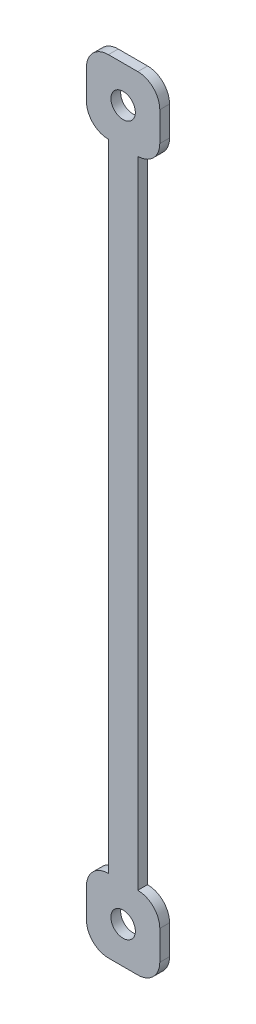
ISO-10303-21;
HEADER;
FILE_DESCRIPTION(('STEP AP214'),'2;1');
FILE_NAME('part.step','',(''),(''),'','','');
FILE_SCHEMA(('AUTOMOTIVE_DESIGN { 1 0 10303 214 1 1 1 1 }'));
ENDSEC;
DATA;
#1=APPLICATION_CONTEXT('core data for automotive mechanical design processes');
#2=APPLICATION_PROTOCOL_DEFINITION('international standard','automotive_design',2000,#1);
#3=PRODUCT_CONTEXT('',#1,'mechanical');
#4=PRODUCT('Part','Part','',(#3));
#5=PRODUCT_RELATED_PRODUCT_CATEGORY('part','',(#4));
#6=PRODUCT_DEFINITION_FORMATION('','',#4);
#7=PRODUCT_DEFINITION_CONTEXT('part definition',#1,'design');
#8=PRODUCT_DEFINITION('design','',#6,#7);
#9=PRODUCT_DEFINITION_SHAPE('','',#8);
#10=(LENGTH_UNIT() NAMED_UNIT(*) SI_UNIT(.MILLI.,.METRE.));
#11=(NAMED_UNIT(*) PLANE_ANGLE_UNIT() SI_UNIT($,.RADIAN.));
#12=(NAMED_UNIT(*) SI_UNIT($,.STERADIAN.) SOLID_ANGLE_UNIT());
#13=UNCERTAINTY_MEASURE_WITH_UNIT(LENGTH_MEASURE(1.E-05),#10,'distance_accuracy_value','');
#14=(GEOMETRIC_REPRESENTATION_CONTEXT(3) GLOBAL_UNCERTAINTY_ASSIGNED_CONTEXT((#13)) GLOBAL_UNIT_ASSIGNED_CONTEXT((#10,
#11,#12)) REPRESENTATION_CONTEXT('',''));
#15=CARTESIAN_POINT('',(0.,0.,0.));
#16=DIRECTION('',(0.,0.,1.));
#17=DIRECTION('',(1.,0.,0.));
#18=AXIS2_PLACEMENT_3D('',#15,#16,#17);
#19=CARTESIAN_POINT('',(0.,0.,2.));
#20=DIRECTION('',(0.,0.,-1.));
#21=DIRECTION('',(-1.,0.,0.));
#22=AXIS2_PLACEMENT_3D('',#19,#20,#21);
#23=PLANE('',#22);
#24=DIRECTION('',(-1.,0.,0.));
#25=VECTOR('',#24,1.);
#26=CARTESIAN_POINT('',(-7.5,7.5,2.));
#27=LINE('',#26,#25);
#28=CARTESIAN_POINT('',(3.,7.5,2.));
#29=VERTEX_POINT('',#28);
#30=CARTESIAN_POINT('',(-3.,7.5,2.));
#31=VERTEX_POINT('',#30);
#32=EDGE_CURVE('E308',#29,#31,#27,.T.);
#33=ORIENTED_EDGE('',*,*,#32,.T.);
#34=CARTESIAN_POINT('',(-3.,3.,2.));
#35=DIRECTION('',(0.,0.,-1.));
#36=DIRECTION('',(-1.,0.,0.));
#37=AXIS2_PLACEMENT_3D('',#34,#35,#36);
#38=CIRCLE('',#37,4.5);
#39=CARTESIAN_POINT('',(-7.5,3.,2.));
#40=VERTEX_POINT('',#39);
#41=EDGE_CURVE('E170',#31,#40,#38,.F.);
#42=ORIENTED_EDGE('',*,*,#41,.T.);
#43=DIRECTION('',(0.,-1.,0.));
#44=VECTOR('',#43,1.);
#45=CARTESIAN_POINT('',(-7.5,7.5,2.));
#46=LINE('',#45,#44);
#47=CARTESIAN_POINT('',(-7.5,-3.,2.));
#48=VERTEX_POINT('',#47);
#49=EDGE_CURVE('E165',#40,#48,#46,.T.);
#50=ORIENTED_EDGE('',*,*,#49,.T.);
#51=CARTESIAN_POINT('',(-3.,-3.,2.));
#52=DIRECTION('',(0.,0.,-1.));
#53=DIRECTION('',(-1.,0.,0.));
#54=AXIS2_PLACEMENT_3D('',#51,#52,#53);
#55=CIRCLE('',#54,4.5);
#56=CARTESIAN_POINT('',(-3.00000000000002,-7.5,2.));
#57=VERTEX_POINT('',#56);
#58=EDGE_CURVE('E158',#48,#57,#55,.F.);
#59=ORIENTED_EDGE('',*,*,#58,.T.);
#60=DIRECTION('',(0.,-1.,0.));
#61=VECTOR('',#60,1.);
#62=CARTESIAN_POINT('',(-3.00000000000002,-7.5,2.));
#63=LINE('',#62,#61);
#64=CARTESIAN_POINT('',(-3.,-137.5,2.));
#65=VERTEX_POINT('',#64);
#66=EDGE_CURVE('E162',#57,#65,#63,.T.);
#67=ORIENTED_EDGE('',*,*,#66,.T.);
#68=CARTESIAN_POINT('',(-3.,-142.,2.));
#69=DIRECTION('',(0.,0.,-1.));
#70=DIRECTION('',(-1.,0.,0.));
#71=AXIS2_PLACEMENT_3D('',#68,#69,#70);
#72=CIRCLE('',#71,4.5);
#73=CARTESIAN_POINT('',(-7.5,-142.,2.));
#74=VERTEX_POINT('',#73);
#75=EDGE_CURVE('E230',#65,#74,#72,.F.);
#76=ORIENTED_EDGE('',*,*,#75,.T.);
#77=DIRECTION('',(0.,-1.,0.));
#78=VECTOR('',#77,1.);
#79=CARTESIAN_POINT('',(-7.5,-137.5,2.));
#80=LINE('',#79,#78);
#81=CARTESIAN_POINT('',(-7.5,-148.,2.));
#82=VERTEX_POINT('',#81);
#83=EDGE_CURVE('E182',#74,#82,#80,.T.);
#84=ORIENTED_EDGE('',*,*,#83,.T.);
#85=CARTESIAN_POINT('',(-3.,-148.,2.));
#86=DIRECTION('',(0.,0.,-1.));
#87=DIRECTION('',(-1.,0.,0.));
#88=AXIS2_PLACEMENT_3D('',#85,#86,#87);
#89=CIRCLE('',#88,4.5);
#90=CARTESIAN_POINT('',(-3.,-152.5,2.));
#91=VERTEX_POINT('',#90);
#92=EDGE_CURVE('E233',#82,#91,#89,.F.);
#93=ORIENTED_EDGE('',*,*,#92,.T.);
#94=DIRECTION('',(1.,0.,0.));
#95=VECTOR('',#94,1.);
#96=CARTESIAN_POINT('',(-7.5,-152.5,2.));
#97=LINE('',#96,#95);
#98=CARTESIAN_POINT('',(3.,-152.5,2.));
#99=VERTEX_POINT('',#98);
#100=EDGE_CURVE('E352',#91,#99,#97,.T.);
#101=ORIENTED_EDGE('',*,*,#100,.T.);
#102=CARTESIAN_POINT('',(3.,-148.,2.));
#103=DIRECTION('',(0.,0.,-1.));
#104=DIRECTION('',(-1.,0.,0.));
#105=AXIS2_PLACEMENT_3D('',#102,#103,#104);
#106=CIRCLE('',#105,4.5);
#107=CARTESIAN_POINT('',(7.5,-148.,2.));
#108=VERTEX_POINT('',#107);
#109=EDGE_CURVE('E239',#99,#108,#106,.F.);
#110=ORIENTED_EDGE('',*,*,#109,.T.);
#111=DIRECTION('',(0.,1.,0.));
#112=VECTOR('',#111,1.);
#113=CARTESIAN_POINT('',(7.5,-152.5,2.));
#114=LINE('',#113,#112);
#115=CARTESIAN_POINT('',(7.5,-142.,2.));
#116=VERTEX_POINT('',#115);
#117=EDGE_CURVE('E334',#108,#116,#114,.T.);
#118=ORIENTED_EDGE('',*,*,#117,.T.);
#119=CARTESIAN_POINT('',(3.,-142.,2.));
#120=DIRECTION('',(0.,0.,-1.));
#121=DIRECTION('',(-1.,0.,0.));
#122=AXIS2_PLACEMENT_3D('',#119,#120,#121);
#123=CIRCLE('',#122,4.5);
#124=CARTESIAN_POINT('',(3.,-137.5,2.));
#125=VERTEX_POINT('',#124);
#126=EDGE_CURVE('E236',#116,#125,#123,.F.);
#127=ORIENTED_EDGE('',*,*,#126,.T.);
#128=DIRECTION('',(0.,1.,0.));
#129=VECTOR('',#128,1.);
#130=CARTESIAN_POINT('',(3.,-137.5,2.));
#131=LINE('',#130,#129);
#132=CARTESIAN_POINT('',(3.,-7.50000000000001,2.));
#133=VERTEX_POINT('',#132);
#134=EDGE_CURVE('E321',#125,#133,#131,.T.);
#135=ORIENTED_EDGE('',*,*,#134,.T.);
#136=CARTESIAN_POINT('',(3.,-3.00000000000001,2.));
#137=DIRECTION('',(0.,0.,-1.));
#138=DIRECTION('',(-1.,0.,0.));
#139=AXIS2_PLACEMENT_3D('',#136,#137,#138);
#140=CIRCLE('',#139,4.5);
#141=CARTESIAN_POINT('',(7.5,-3.00000000000001,2.));
#142=VERTEX_POINT('',#141);
#143=EDGE_CURVE('E68',#133,#142,#140,.F.);
#144=ORIENTED_EDGE('',*,*,#143,.T.);
#145=DIRECTION('',(0.,1.,0.));
#146=VECTOR('',#145,1.);
#147=CARTESIAN_POINT('',(7.5,7.5,2.));
#148=LINE('',#147,#146);
#149=CARTESIAN_POINT('',(7.5,3.,2.));
#150=VERTEX_POINT('',#149);
#151=EDGE_CURVE('E312',#142,#150,#148,.T.);
#152=ORIENTED_EDGE('',*,*,#151,.T.);
#153=CARTESIAN_POINT('',(3.,3.,2.));
#154=DIRECTION('',(0.,0.,-1.));
#155=DIRECTION('',(-1.,0.,0.));
#156=AXIS2_PLACEMENT_3D('',#153,#154,#155);
#157=CIRCLE('',#156,4.5);
#158=EDGE_CURVE('E242',#150,#29,#157,.F.);
#159=ORIENTED_EDGE('',*,*,#158,.T.);
#160=EDGE_LOOP('',(#33,#42,#50,#59,#67,#76,#84,#93,#101,#110,#118,#127,#135,#144,#152,#159));
#161=FACE_BOUND('',#160,.T.);
#162=CARTESIAN_POINT('',(0.,0.,2.));
#163=DIRECTION('',(0.,0.,1.));
#164=DIRECTION('',(1.,0.,0.));
#165=AXIS2_PLACEMENT_3D('',#162,#163,#164);
#166=CIRCLE('',#165,2.5);
#167=CARTESIAN_POINT('',(2.5,0.,2.));
#168=VERTEX_POINT('',#167);
#169=EDGE_CURVE('E341',#168,#168,#166,.T.);
#170=ORIENTED_EDGE('',*,*,#169,.F.);
#171=EDGE_LOOP('',(#170));
#172=FACE_BOUND('',#171,.T.);
#173=CARTESIAN_POINT('',(0.,-145.,2.));
#174=DIRECTION('',(0.,0.,1.));
#175=DIRECTION('',(1.,0.,0.));
#176=AXIS2_PLACEMENT_3D('',#173,#174,#175);
#177=CIRCLE('',#176,2.5);
#178=CARTESIAN_POINT('',(2.5,-145.,2.));
#179=VERTEX_POINT('',#178);
#180=EDGE_CURVE('E381',#179,#179,#177,.T.);
#181=ORIENTED_EDGE('',*,*,#180,.F.);
#182=EDGE_LOOP('',(#181));
#183=FACE_BOUND('',#182,.T.);
#184=ADVANCED_FACE('F45',(#161,#172,#183),#23,.F.);
#185=CARTESIAN_POINT('',(0.,0.,0.));
#186=DIRECTION('',(0.,0.,-1.));
#187=DIRECTION('',(-1.,0.,0.));
#188=AXIS2_PLACEMENT_3D('',#185,#186,#187);
#189=PLANE('',#188);
#190=CARTESIAN_POINT('',(0.,0.,0.));
#191=DIRECTION('',(0.,0.,1.));
#192=DIRECTION('',(1.,0.,0.));
#193=AXIS2_PLACEMENT_3D('',#190,#191,#192);
#194=CIRCLE('',#193,2.5);
#195=CARTESIAN_POINT('',(2.5,0.,0.));
#196=VERTEX_POINT('',#195);
#197=EDGE_CURVE('E377',#196,#196,#194,.T.);
#198=ORIENTED_EDGE('',*,*,#197,.T.);
#199=EDGE_LOOP('',(#198));
#200=FACE_BOUND('',#199,.T.);
#201=DIRECTION('',(0.,-1.,0.));
#202=VECTOR('',#201,1.);
#203=CARTESIAN_POINT('',(-7.5,7.5,0.));
#204=LINE('',#203,#202);
#205=CARTESIAN_POINT('',(-7.5,3.,0.));
#206=VERTEX_POINT('',#205);
#207=CARTESIAN_POINT('',(-7.5,-3.,0.));
#208=VERTEX_POINT('',#207);
#209=EDGE_CURVE('E294',#206,#208,#204,.T.);
#210=ORIENTED_EDGE('',*,*,#209,.F.);
#211=CARTESIAN_POINT('',(-3.,3.,0.));
#212=DIRECTION('',(0.,0.,-1.));
#213=DIRECTION('',(-1.,0.,0.));
#214=AXIS2_PLACEMENT_3D('',#211,#212,#213);
#215=CIRCLE('',#214,4.5);
#216=CARTESIAN_POINT('',(-3.,7.5,0.));
#217=VERTEX_POINT('',#216);
#218=EDGE_CURVE('E220',#206,#217,#215,.T.);
#219=ORIENTED_EDGE('',*,*,#218,.T.);
#220=DIRECTION('',(-1.,0.,0.));
#221=VECTOR('',#220,1.);
#222=CARTESIAN_POINT('',(-7.5,7.5,0.));
#223=LINE('',#222,#221);
#224=CARTESIAN_POINT('',(3.,7.5,0.));
#225=VERTEX_POINT('',#224);
#226=EDGE_CURVE('E338',#225,#217,#223,.T.);
#227=ORIENTED_EDGE('',*,*,#226,.F.);
#228=CARTESIAN_POINT('',(3.,3.,0.));
#229=DIRECTION('',(0.,0.,-1.));
#230=DIRECTION('',(-1.,0.,0.));
#231=AXIS2_PLACEMENT_3D('',#228,#229,#230);
#232=CIRCLE('',#231,4.5);
#233=CARTESIAN_POINT('',(7.5,3.,0.));
#234=VERTEX_POINT('',#233);
#235=EDGE_CURVE('E212',#225,#234,#232,.T.);
#236=ORIENTED_EDGE('',*,*,#235,.T.);
#237=DIRECTION('',(0.,1.,0.));
#238=VECTOR('',#237,1.);
#239=CARTESIAN_POINT('',(7.5,7.5,0.));
#240=LINE('',#239,#238);
#241=CARTESIAN_POINT('',(7.5,-3.00000000000001,0.));
#242=VERTEX_POINT('',#241);
#243=EDGE_CURVE('E305',#242,#234,#240,.T.);
#244=ORIENTED_EDGE('',*,*,#243,.F.);
#245=CARTESIAN_POINT('',(3.,-3.00000000000001,0.));
#246=DIRECTION('',(0.,0.,-1.));
#247=DIRECTION('',(-1.,0.,0.));
#248=AXIS2_PLACEMENT_3D('',#245,#246,#247);
#249=CIRCLE('',#248,4.5);
#250=CARTESIAN_POINT('',(3.,-7.50000000000001,0.));
#251=VERTEX_POINT('',#250);
#252=EDGE_CURVE('E215',#242,#251,#249,.T.);
#253=ORIENTED_EDGE('',*,*,#252,.T.);
#254=DIRECTION('',(0.,1.,0.));
#255=VECTOR('',#254,1.);
#256=CARTESIAN_POINT('',(3.,-137.5,0.));
#257=LINE('',#256,#255);
#258=CARTESIAN_POINT('',(3.,-137.5,0.));
#259=VERTEX_POINT('',#258);
#260=EDGE_CURVE('E301',#259,#251,#257,.T.);
#261=ORIENTED_EDGE('',*,*,#260,.F.);
#262=CARTESIAN_POINT('',(3.,-142.,0.));
#263=DIRECTION('',(0.,0.,-1.));
#264=DIRECTION('',(-1.,0.,0.));
#265=AXIS2_PLACEMENT_3D('',#262,#263,#264);
#266=CIRCLE('',#265,4.5);
#267=CARTESIAN_POINT('',(7.5,-142.,0.));
#268=VERTEX_POINT('',#267);
#269=EDGE_CURVE('E206',#259,#268,#266,.T.);
#270=ORIENTED_EDGE('',*,*,#269,.T.);
#271=DIRECTION('',(0.,1.,0.));
#272=VECTOR('',#271,1.);
#273=CARTESIAN_POINT('',(7.5,-152.5,0.));
#274=LINE('',#273,#272);
#275=CARTESIAN_POINT('',(7.5,-148.,0.));
#276=VERTEX_POINT('',#275);
#277=EDGE_CURVE('E292',#276,#268,#274,.T.);
#278=ORIENTED_EDGE('',*,*,#277,.F.);
#279=CARTESIAN_POINT('',(3.,-148.,0.));
#280=DIRECTION('',(0.,0.,-1.));
#281=DIRECTION('',(-1.,0.,0.));
#282=AXIS2_PLACEMENT_3D('',#279,#280,#281);
#283=CIRCLE('',#282,4.5);
#284=CARTESIAN_POINT('',(3.,-152.5,0.));
#285=VERTEX_POINT('',#284);
#286=EDGE_CURVE('E209',#276,#285,#283,.T.);
#287=ORIENTED_EDGE('',*,*,#286,.T.);
#288=DIRECTION('',(1.,0.,0.));
#289=VECTOR('',#288,1.);
#290=CARTESIAN_POINT('',(-7.5,-152.5,0.));
#291=LINE('',#290,#289);
#292=CARTESIAN_POINT('',(-3.,-152.5,0.));
#293=VERTEX_POINT('',#292);
#294=EDGE_CURVE('E286',#293,#285,#291,.T.);
#295=ORIENTED_EDGE('',*,*,#294,.F.);
#296=CARTESIAN_POINT('',(-3.,-148.,0.));
#297=DIRECTION('',(0.,0.,-1.));
#298=DIRECTION('',(-1.,0.,0.));
#299=AXIS2_PLACEMENT_3D('',#296,#297,#298);
#300=CIRCLE('',#299,4.5);
#301=CARTESIAN_POINT('',(-7.5,-148.,0.));
#302=VERTEX_POINT('',#301);
#303=EDGE_CURVE('E203',#293,#302,#300,.T.);
#304=ORIENTED_EDGE('',*,*,#303,.T.);
#305=DIRECTION('',(0.,-1.,0.));
#306=VECTOR('',#305,1.);
#307=CARTESIAN_POINT('',(-7.5,-137.5,0.));
#308=LINE('',#307,#306);
#309=CARTESIAN_POINT('',(-7.5,-142.,0.));
#310=VERTEX_POINT('',#309);
#311=EDGE_CURVE('E276',#310,#302,#308,.T.);
#312=ORIENTED_EDGE('',*,*,#311,.F.);
#313=CARTESIAN_POINT('',(-3.,-142.,0.));
#314=DIRECTION('',(0.,0.,-1.));
#315=DIRECTION('',(-1.,0.,0.));
#316=AXIS2_PLACEMENT_3D('',#313,#314,#315);
#317=CIRCLE('',#316,4.5);
#318=CARTESIAN_POINT('',(-3.,-137.5,0.));
#319=VERTEX_POINT('',#318);
#320=EDGE_CURVE('E200',#310,#319,#317,.T.);
#321=ORIENTED_EDGE('',*,*,#320,.T.);
#322=DIRECTION('',(0.,-1.,0.));
#323=VECTOR('',#322,1.);
#324=CARTESIAN_POINT('',(-3.00000000000002,-7.5,0.));
#325=LINE('',#324,#323);
#326=CARTESIAN_POINT('',(-3.00000000000002,-7.5,0.));
#327=VERTEX_POINT('',#326);
#328=EDGE_CURVE('E287',#327,#319,#325,.T.);
#329=ORIENTED_EDGE('',*,*,#328,.F.);
#330=CARTESIAN_POINT('',(-3.,-3.,0.));
#331=DIRECTION('',(0.,0.,-1.));
#332=DIRECTION('',(-1.,0.,0.));
#333=AXIS2_PLACEMENT_3D('',#330,#331,#332);
#334=CIRCLE('',#333,4.5);
#335=EDGE_CURVE('E185',#327,#208,#334,.T.);
#336=ORIENTED_EDGE('',*,*,#335,.T.);
#337=EDGE_LOOP('',(#210,#219,#227,#236,#244,#253,#261,#270,#278,#287,#295,#304,#312,#321,#329,#336));
#338=FACE_BOUND('',#337,.T.);
#339=CARTESIAN_POINT('',(0.,-145.,0.));
#340=DIRECTION('',(0.,0.,1.));
#341=DIRECTION('',(1.,0.,0.));
#342=AXIS2_PLACEMENT_3D('',#339,#340,#341);
#343=CIRCLE('',#342,2.5);
#344=CARTESIAN_POINT('',(2.5,-145.,0.));
#345=VERTEX_POINT('',#344);
#346=EDGE_CURVE('E385',#345,#345,#343,.T.);
#347=ORIENTED_EDGE('',*,*,#346,.T.);
#348=EDGE_LOOP('',(#347));
#349=FACE_BOUND('',#348,.T.);
#350=ADVANCED_FACE('F282',(#200,#338,#349),#189,.T.);
#351=CARTESIAN_POINT('',(-7.5,7.5,2.));
#352=DIRECTION('',(0.,-1.,0.));
#353=DIRECTION('',(0.,0.,-1.));
#354=AXIS2_PLACEMENT_3D('',#351,#352,#353);
#355=PLANE('',#354);
#356=ORIENTED_EDGE('',*,*,#226,.T.);
#357=DIRECTION('',(0.,0.,-1.));
#358=VECTOR('',#357,1.);
#359=CARTESIAN_POINT('',(-3.,7.5,2.));
#360=LINE('',#359,#358);
#361=EDGE_CURVE('E227',#217,#31,#360,.F.);
#362=ORIENTED_EDGE('',*,*,#361,.T.);
#363=ORIENTED_EDGE('',*,*,#32,.F.);
#364=DIRECTION('',(0.,0.,-1.));
#365=VECTOR('',#364,1.);
#366=CARTESIAN_POINT('',(3.,7.5,2.));
#367=LINE('',#366,#365);
#368=EDGE_CURVE('E223',#29,#225,#367,.T.);
#369=ORIENTED_EDGE('',*,*,#368,.T.);
#370=EDGE_LOOP('',(#356,#362,#363,#369));
#371=FACE_BOUND('',#370,.T.);
#372=ADVANCED_FACE('F402',(#371),#355,.F.);
#373=CARTESIAN_POINT('',(-7.5,7.5,2.));
#374=DIRECTION('',(1.,0.,0.));
#375=DIRECTION('',(0.,1.,0.));
#376=AXIS2_PLACEMENT_3D('',#373,#374,#375);
#377=PLANE('',#376);
#378=ORIENTED_EDGE('',*,*,#49,.F.);
#379=DIRECTION('',(0.,0.,-1.));
#380=VECTOR('',#379,1.);
#381=CARTESIAN_POINT('',(-7.5,3.,2.));
#382=LINE('',#381,#380);
#383=EDGE_CURVE('E191',#40,#206,#382,.T.);
#384=ORIENTED_EDGE('',*,*,#383,.T.);
#385=ORIENTED_EDGE('',*,*,#209,.T.);
#386=DIRECTION('',(0.,0.,-1.));
#387=VECTOR('',#386,1.);
#388=CARTESIAN_POINT('',(-7.5,-3.,2.));
#389=LINE('',#388,#387);
#390=EDGE_CURVE('E187',#208,#48,#389,.F.);
#391=ORIENTED_EDGE('',*,*,#390,.T.);
#392=EDGE_LOOP('',(#378,#384,#385,#391));
#393=FACE_BOUND('',#392,.T.);
#394=ADVANCED_FACE('F345',(#393),#377,.F.);
#395=CARTESIAN_POINT('',(-3.00000000000002,-7.5,2.));
#396=DIRECTION('',(1.,0.,0.));
#397=DIRECTION('',(0.,1.,0.));
#398=AXIS2_PLACEMENT_3D('',#395,#396,#397);
#399=PLANE('',#398);
#400=ORIENTED_EDGE('',*,*,#328,.T.);
#401=DIRECTION('',(0.,0.,-1.));
#402=VECTOR('',#401,1.);
#403=CARTESIAN_POINT('',(-3.,-137.5,2.));
#404=LINE('',#403,#402);
#405=EDGE_CURVE('E179',#65,#319,#404,.T.);
#406=ORIENTED_EDGE('',*,*,#405,.F.);
#407=ORIENTED_EDGE('',*,*,#66,.F.);
#408=DIRECTION('',(0.,0.,-1.));
#409=VECTOR('',#408,1.);
#410=CARTESIAN_POINT('',(-3.00000000000002,-7.5,2.));
#411=LINE('',#410,#409);
#412=EDGE_CURVE('E176',#57,#327,#411,.T.);
#413=ORIENTED_EDGE('',*,*,#412,.T.);
#414=EDGE_LOOP('',(#400,#406,#407,#413));
#415=FACE_BOUND('',#414,.T.);
#416=ADVANCED_FACE('F175',(#415),#399,.F.);
#417=CARTESIAN_POINT('',(-7.5,-137.5,2.));
#418=DIRECTION('',(1.,0.,0.));
#419=DIRECTION('',(0.,0.,-1.));
#420=AXIS2_PLACEMENT_3D('',#417,#418,#419);
#421=PLANE('',#420);
#422=ORIENTED_EDGE('',*,*,#311,.T.);
#423=DIRECTION('',(0.,0.,-1.));
#424=VECTOR('',#423,1.);
#425=CARTESIAN_POINT('',(-7.5,-148.,2.));
#426=LINE('',#425,#424);
#427=EDGE_CURVE('E11',#302,#82,#426,.F.);
#428=ORIENTED_EDGE('',*,*,#427,.T.);
#429=ORIENTED_EDGE('',*,*,#83,.F.);
#430=DIRECTION('',(0.,0.,-1.));
#431=VECTOR('',#430,1.);
#432=CARTESIAN_POINT('',(-7.5,-142.,2.));
#433=LINE('',#432,#431);
#434=EDGE_CURVE('E54',#74,#310,#433,.T.);
#435=ORIENTED_EDGE('',*,*,#434,.T.);
#436=EDGE_LOOP('',(#422,#428,#429,#435));
#437=FACE_BOUND('',#436,.T.);
#438=ADVANCED_FACE('F275',(#437),#421,.F.);
#439=CARTESIAN_POINT('',(-7.5,-152.5,2.));
#440=DIRECTION('',(0.,1.,0.));
#441=DIRECTION('',(0.,0.,1.));
#442=AXIS2_PLACEMENT_3D('',#439,#440,#441);
#443=PLANE('',#442);
#444=ORIENTED_EDGE('',*,*,#294,.T.);
#445=DIRECTION('',(0.,0.,-1.));
#446=VECTOR('',#445,1.);
#447=CARTESIAN_POINT('',(3.,-152.5,2.));
#448=LINE('',#447,#446);
#449=EDGE_CURVE('E266',#285,#99,#448,.F.);
#450=ORIENTED_EDGE('',*,*,#449,.T.);
#451=ORIENTED_EDGE('',*,*,#100,.F.);
#452=DIRECTION('',(0.,0.,-1.));
#453=VECTOR('',#452,1.);
#454=CARTESIAN_POINT('',(-3.,-152.5,2.));
#455=LINE('',#454,#453);
#456=EDGE_CURVE('E262',#91,#293,#455,.T.);
#457=ORIENTED_EDGE('',*,*,#456,.T.);
#458=EDGE_LOOP('',(#444,#450,#451,#457));
#459=FACE_BOUND('',#458,.T.);
#460=ADVANCED_FACE('F358',(#459),#443,.F.);
#461=CARTESIAN_POINT('',(7.5,-152.5,2.));
#462=DIRECTION('',(-1.,0.,0.));
#463=DIRECTION('',(0.,0.,1.));
#464=AXIS2_PLACEMENT_3D('',#461,#462,#463);
#465=PLANE('',#464);
#466=ORIENTED_EDGE('',*,*,#117,.F.);
#467=DIRECTION('',(0.,0.,-1.));
#468=VECTOR('',#467,1.);
#469=CARTESIAN_POINT('',(7.5,-148.,2.));
#470=LINE('',#469,#468);
#471=EDGE_CURVE('E258',#108,#276,#470,.T.);
#472=ORIENTED_EDGE('',*,*,#471,.T.);
#473=ORIENTED_EDGE('',*,*,#277,.T.);
#474=DIRECTION('',(0.,0.,-1.));
#475=VECTOR('',#474,1.);
#476=CARTESIAN_POINT('',(7.5,-142.,2.));
#477=LINE('',#476,#475);
#478=EDGE_CURVE('E255',#268,#116,#477,.F.);
#479=ORIENTED_EDGE('',*,*,#478,.T.);
#480=EDGE_LOOP('',(#466,#472,#473,#479));
#481=FACE_BOUND('',#480,.T.);
#482=ADVANCED_FACE('F366',(#481),#465,.F.);
#483=CARTESIAN_POINT('',(3.,-137.5,2.));
#484=DIRECTION('',(-1.,0.,0.));
#485=DIRECTION('',(0.,0.,1.));
#486=AXIS2_PLACEMENT_3D('',#483,#484,#485);
#487=PLANE('',#486);
#488=ORIENTED_EDGE('',*,*,#260,.T.);
#489=DIRECTION('',(0.,0.,-1.));
#490=VECTOR('',#489,1.);
#491=CARTESIAN_POINT('',(3.,-7.50000000000001,2.));
#492=LINE('',#491,#490);
#493=EDGE_CURVE('E309',#133,#251,#492,.T.);
#494=ORIENTED_EDGE('',*,*,#493,.F.);
#495=ORIENTED_EDGE('',*,*,#134,.F.);
#496=DIRECTION('',(0.,0.,-1.));
#497=VECTOR('',#496,1.);
#498=CARTESIAN_POINT('',(3.,-137.5,2.));
#499=LINE('',#498,#497);
#500=EDGE_CURVE('E193',#125,#259,#499,.T.);
#501=ORIENTED_EDGE('',*,*,#500,.T.);
#502=EDGE_LOOP('',(#488,#494,#495,#501));
#503=FACE_BOUND('',#502,.T.);
#504=ADVANCED_FACE('F319',(#503),#487,.F.);
#505=CARTESIAN_POINT('',(7.5,7.5,2.));
#506=DIRECTION('',(-1.,0.,0.));
#507=DIRECTION('',(0.,0.,1.));
#508=AXIS2_PLACEMENT_3D('',#505,#506,#507);
#509=PLANE('',#508);
#510=ORIENTED_EDGE('',*,*,#151,.F.);
#511=DIRECTION('',(0.,0.,-1.));
#512=VECTOR('',#511,1.);
#513=CARTESIAN_POINT('',(7.5,-3.00000000000001,2.));
#514=LINE('',#513,#512);
#515=EDGE_CURVE('E251',#142,#242,#514,.T.);
#516=ORIENTED_EDGE('',*,*,#515,.T.);
#517=ORIENTED_EDGE('',*,*,#243,.T.);
#518=DIRECTION('',(0.,0.,-1.));
#519=VECTOR('',#518,1.);
#520=CARTESIAN_POINT('',(7.5,3.,2.));
#521=LINE('',#520,#519);
#522=EDGE_CURVE('E61',#234,#150,#521,.F.);
#523=ORIENTED_EDGE('',*,*,#522,.T.);
#524=EDGE_LOOP('',(#510,#516,#517,#523));
#525=FACE_BOUND('',#524,.T.);
#526=ADVANCED_FACE('F329',(#525),#509,.F.);
#527=CARTESIAN_POINT('',(0.,0.,2.));
#528=DIRECTION('',(0.,0.,-1.));
#529=DIRECTION('',(-1.,0.,0.));
#530=AXIS2_PLACEMENT_3D('',#527,#528,#529);
#531=CYLINDRICAL_SURFACE('',#530,2.5);
#532=ORIENTED_EDGE('',*,*,#169,.T.);
#533=EDGE_LOOP('',(#532));
#534=FACE_BOUND('',#533,.T.);
#535=ORIENTED_EDGE('',*,*,#197,.F.);
#536=EDGE_LOOP('',(#535));
#537=FACE_BOUND('',#536,.T.);
#538=ADVANCED_FACE('F406',(#534,#537),#531,.F.);
#539=CARTESIAN_POINT('',(0.,-145.,2.));
#540=DIRECTION('',(0.,0.,-1.));
#541=DIRECTION('',(-1.,0.,0.));
#542=AXIS2_PLACEMENT_3D('',#539,#540,#541);
#543=CYLINDRICAL_SURFACE('',#542,2.5);
#544=ORIENTED_EDGE('',*,*,#180,.T.);
#545=EDGE_LOOP('',(#544));
#546=FACE_BOUND('',#545,.T.);
#547=ORIENTED_EDGE('',*,*,#346,.F.);
#548=EDGE_LOOP('',(#547));
#549=FACE_BOUND('',#548,.T.);
#550=ADVANCED_FACE('F393',(#546,#549),#543,.F.);
#551=CARTESIAN_POINT('',(-3.,3.,2.));
#552=DIRECTION('',(0.,0.,-1.));
#553=DIRECTION('',(-1.,0.,0.));
#554=AXIS2_PLACEMENT_3D('',#551,#552,#553);
#555=CYLINDRICAL_SURFACE('',#554,4.5);
#556=ORIENTED_EDGE('',*,*,#41,.F.);
#557=ORIENTED_EDGE('',*,*,#361,.F.);
#558=ORIENTED_EDGE('',*,*,#218,.F.);
#559=ORIENTED_EDGE('',*,*,#383,.F.);
#560=EDGE_LOOP('',(#556,#557,#558,#559));
#561=FACE_BOUND('',#560,.T.);
#562=ADVANCED_FACE('F426',(#561),#555,.T.);
#563=CARTESIAN_POINT('',(-3.,-3.,2.));
#564=DIRECTION('',(0.,0.,-1.));
#565=DIRECTION('',(-1.,0.,0.));
#566=AXIS2_PLACEMENT_3D('',#563,#564,#565);
#567=CYLINDRICAL_SURFACE('',#566,4.5);
#568=ORIENTED_EDGE('',*,*,#58,.F.);
#569=ORIENTED_EDGE('',*,*,#390,.F.);
#570=ORIENTED_EDGE('',*,*,#335,.F.);
#571=ORIENTED_EDGE('',*,*,#412,.F.);
#572=EDGE_LOOP('',(#568,#569,#570,#571));
#573=FACE_BOUND('',#572,.T.);
#574=ADVANCED_FACE('F184',(#573),#567,.T.);
#575=CARTESIAN_POINT('',(3.,-3.00000000000001,2.));
#576=DIRECTION('',(0.,0.,-1.));
#577=DIRECTION('',(-1.,0.,0.));
#578=AXIS2_PLACEMENT_3D('',#575,#576,#577);
#579=CYLINDRICAL_SURFACE('',#578,4.5);
#580=ORIENTED_EDGE('',*,*,#143,.F.);
#581=ORIENTED_EDGE('',*,*,#493,.T.);
#582=ORIENTED_EDGE('',*,*,#252,.F.);
#583=ORIENTED_EDGE('',*,*,#515,.F.);
#584=EDGE_LOOP('',(#580,#581,#582,#583));
#585=FACE_BOUND('',#584,.T.);
#586=ADVANCED_FACE('F328',(#585),#579,.T.);
#587=CARTESIAN_POINT('',(3.,3.,2.));
#588=DIRECTION('',(0.,0.,-1.));
#589=DIRECTION('',(-1.,0.,0.));
#590=AXIS2_PLACEMENT_3D('',#587,#588,#589);
#591=CYLINDRICAL_SURFACE('',#590,4.5);
#592=ORIENTED_EDGE('',*,*,#158,.F.);
#593=ORIENTED_EDGE('',*,*,#522,.F.);
#594=ORIENTED_EDGE('',*,*,#235,.F.);
#595=ORIENTED_EDGE('',*,*,#368,.F.);
#596=EDGE_LOOP('',(#592,#593,#594,#595));
#597=FACE_BOUND('',#596,.T.);
#598=ADVANCED_FACE('F434',(#597),#591,.T.);
#599=CARTESIAN_POINT('',(3.,-148.,2.));
#600=DIRECTION('',(0.,0.,-1.));
#601=DIRECTION('',(-1.,0.,0.));
#602=AXIS2_PLACEMENT_3D('',#599,#600,#601);
#603=CYLINDRICAL_SURFACE('',#602,4.5);
#604=ORIENTED_EDGE('',*,*,#109,.F.);
#605=ORIENTED_EDGE('',*,*,#449,.F.);
#606=ORIENTED_EDGE('',*,*,#286,.F.);
#607=ORIENTED_EDGE('',*,*,#471,.F.);
#608=EDGE_LOOP('',(#604,#605,#606,#607));
#609=FACE_BOUND('',#608,.T.);
#610=ADVANCED_FACE('F363',(#609),#603,.T.);
#611=CARTESIAN_POINT('',(3.,-142.,2.));
#612=DIRECTION('',(0.,0.,-1.));
#613=DIRECTION('',(-1.,0.,0.));
#614=AXIS2_PLACEMENT_3D('',#611,#612,#613);
#615=CYLINDRICAL_SURFACE('',#614,4.5);
#616=ORIENTED_EDGE('',*,*,#126,.F.);
#617=ORIENTED_EDGE('',*,*,#478,.F.);
#618=ORIENTED_EDGE('',*,*,#269,.F.);
#619=ORIENTED_EDGE('',*,*,#500,.F.);
#620=EDGE_LOOP('',(#616,#617,#618,#619));
#621=FACE_BOUND('',#620,.T.);
#622=ADVANCED_FACE('F440',(#621),#615,.T.);
#623=CARTESIAN_POINT('',(-3.,-148.,2.));
#624=DIRECTION('',(0.,0.,-1.));
#625=DIRECTION('',(-1.,0.,0.));
#626=AXIS2_PLACEMENT_3D('',#623,#624,#625);
#627=CYLINDRICAL_SURFACE('',#626,4.5);
#628=ORIENTED_EDGE('',*,*,#92,.F.);
#629=ORIENTED_EDGE('',*,*,#427,.F.);
#630=ORIENTED_EDGE('',*,*,#303,.F.);
#631=ORIENTED_EDGE('',*,*,#456,.F.);
#632=EDGE_LOOP('',(#628,#629,#630,#631));
#633=FACE_BOUND('',#632,.T.);
#634=ADVANCED_FACE('F356',(#633),#627,.T.);
#635=CARTESIAN_POINT('',(-3.,-142.,2.));
#636=DIRECTION('',(0.,0.,-1.));
#637=DIRECTION('',(-1.,0.,0.));
#638=AXIS2_PLACEMENT_3D('',#635,#636,#637);
#639=CYLINDRICAL_SURFACE('',#638,4.5);
#640=ORIENTED_EDGE('',*,*,#75,.F.);
#641=ORIENTED_EDGE('',*,*,#405,.T.);
#642=ORIENTED_EDGE('',*,*,#320,.F.);
#643=ORIENTED_EDGE('',*,*,#434,.F.);
#644=EDGE_LOOP('',(#640,#641,#642,#643));
#645=FACE_BOUND('',#644,.T.);
#646=ADVANCED_FACE('F47',(#645),#639,.T.);
#647=CLOSED_SHELL('',(#184,#350,#372,#394,#416,#438,#460,#482,#504,#526,#538,#550,#562,#574,
#586,#598,#610,#622,#634,#646));
#648=MANIFOLD_SOLID_BREP('B2',#647);
#649=ADVANCED_BREP_SHAPE_REPRESENTATION('',(#18,#648),#14);
#650=SHAPE_DEFINITION_REPRESENTATION(#9,#649);
ENDSEC;
END-ISO-10303-21;
